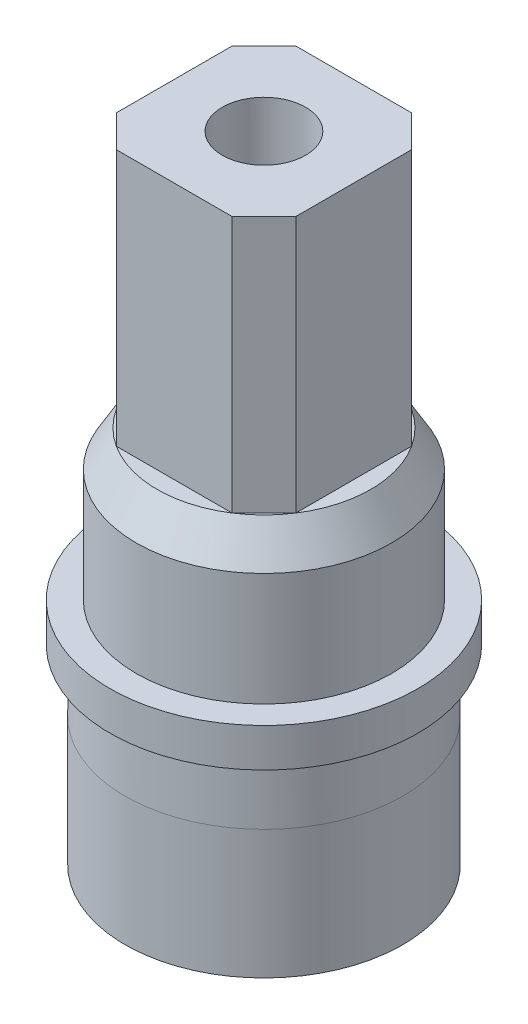
ISO-10303-21;
HEADER;
FILE_DESCRIPTION(('STEP AP214'),'2;1');
FILE_NAME('part.step','',(''),(''),'','','');
FILE_SCHEMA(('AUTOMOTIVE_DESIGN { 1 0 10303 214 1 1 1 1 }'));
ENDSEC;
DATA;
#1=APPLICATION_CONTEXT('core data for automotive mechanical design processes');
#2=APPLICATION_PROTOCOL_DEFINITION('international standard','automotive_design',2000,#1);
#3=PRODUCT_CONTEXT('',#1,'mechanical');
#4=PRODUCT('Part','Part','',(#3));
#5=PRODUCT_RELATED_PRODUCT_CATEGORY('part','',(#4));
#6=PRODUCT_DEFINITION_FORMATION('','',#4);
#7=PRODUCT_DEFINITION_CONTEXT('part definition',#1,'design');
#8=PRODUCT_DEFINITION('design','',#6,#7);
#9=PRODUCT_DEFINITION_SHAPE('','',#8);
#10=(LENGTH_UNIT() NAMED_UNIT(*) SI_UNIT(.MILLI.,.METRE.));
#11=(NAMED_UNIT(*) PLANE_ANGLE_UNIT() SI_UNIT($,.RADIAN.));
#12=(NAMED_UNIT(*) SI_UNIT($,.STERADIAN.) SOLID_ANGLE_UNIT());
#13=UNCERTAINTY_MEASURE_WITH_UNIT(LENGTH_MEASURE(1.E-05),#10,'distance_accuracy_value','');
#14=(GEOMETRIC_REPRESENTATION_CONTEXT(3) GLOBAL_UNCERTAINTY_ASSIGNED_CONTEXT((#13)) GLOBAL_UNIT_ASSIGNED_CONTEXT((#10,
#11,#12)) REPRESENTATION_CONTEXT('',''));
#15=CARTESIAN_POINT('',(0.,0.,0.));
#16=DIRECTION('',(0.,0.,1.));
#17=DIRECTION('',(1.,0.,0.));
#18=AXIS2_PLACEMENT_3D('',#15,#16,#17);
#19=CARTESIAN_POINT('',(0.,-7.46,0.));
#20=DIRECTION('',(0.,1.,0.));
#21=DIRECTION('',(0.,0.,1.));
#22=AXIS2_PLACEMENT_3D('',#19,#20,#21);
#23=CYLINDRICAL_SURFACE('',#22,4.315);
#24=CARTESIAN_POINT('',(0.,0.54,0.));
#25=DIRECTION('',(0.,-1.,0.));
#26=DIRECTION('',(0.,0.,-1.));
#27=AXIS2_PLACEMENT_3D('',#24,#25,#26);
#28=CIRCLE('',#27,4.315);
#29=CARTESIAN_POINT('',(0.,0.54,-4.315));
#30=VERTEX_POINT('',#29);
#31=EDGE_CURVE('E87',#30,#30,#28,.T.);
#32=ORIENTED_EDGE('',*,*,#31,.T.);
#33=EDGE_LOOP('',(#32));
#34=FACE_BOUND('',#33,.T.);
#35=CARTESIAN_POINT('',(0.,-3.46,0.));
#36=DIRECTION('',(0.,-1.,0.));
#37=DIRECTION('',(0.,0.,-1.));
#38=AXIS2_PLACEMENT_3D('',#35,#36,#37);
#39=CIRCLE('',#38,4.315);
#40=CARTESIAN_POINT('',(0.,-3.46,-4.315));
#41=VERTEX_POINT('',#40);
#42=EDGE_CURVE('E82',#41,#41,#39,.T.);
#43=ORIENTED_EDGE('',*,*,#42,.F.);
#44=EDGE_LOOP('',(#43));
#45=FACE_BOUND('',#44,.T.);
#46=ADVANCED_FACE('F48',(#34,#45),#23,.T.);
#47=CARTESIAN_POINT('',(0.089910847244246,2.74,-1.19662694251292));
#48=DIRECTION('',(0.0749257060368717,0.,-0.997189118760768));
#49=DIRECTION('',(-0.997189118760768,0.,-0.0749257060368717));
#50=AXIS2_PLACEMENT_3D('',#47,#48,#49);
#51=PLANE('',#50);
#52=DIRECTION('',(-0.997189118760768,0.,-0.0749257060368717));
#53=VECTOR('',#52,1.);
#54=CARTESIAN_POINT('',(0.089910847244246,-3.46,-1.19662694251292));
#55=LINE('',#54,#53);
#56=CARTESIAN_POINT('',(1.14523661458051,-3.46,-1.11733302852112));
#57=VERTEX_POINT('',#56);
#58=CARTESIAN_POINT('',(-0.965414920092013,-3.46,-1.27592085650472));
#59=VERTEX_POINT('',#58);
#60=EDGE_CURVE('E61',#57,#59,#55,.T.);
#61=ORIENTED_EDGE('',*,*,#60,.F.);
#62=DIRECTION('',(0.,-1.,0.));
#63=VECTOR('',#62,1.);
#64=CARTESIAN_POINT('',(1.1452366145805,2.74,-1.11733302852112));
#65=LINE('',#64,#63);
#66=CARTESIAN_POINT('',(1.1452366145805,0.54,-1.11733302852112));
#67=VERTEX_POINT('',#66);
#68=EDGE_CURVE('E81',#67,#57,#65,.T.);
#69=ORIENTED_EDGE('',*,*,#68,.F.);
#70=DIRECTION('',(0.997189118760768,0.,0.0749257060368717));
#71=VECTOR('',#70,1.);
#72=CARTESIAN_POINT('',(0.089910847244246,0.54,-1.19662694251292));
#73=LINE('',#72,#71);
#74=CARTESIAN_POINT('',(-0.965414920092012,0.54,-1.27592085650472));
#75=VERTEX_POINT('',#74);
#76=EDGE_CURVE('E12',#75,#67,#73,.T.);
#77=ORIENTED_EDGE('',*,*,#76,.F.);
#78=DIRECTION('',(0.,-1.,0.));
#79=VECTOR('',#78,1.);
#80=CARTESIAN_POINT('',(-0.965414920092013,2.74,-1.27592085650472));
#81=LINE('',#80,#79);
#82=EDGE_CURVE('E68',#75,#59,#81,.T.);
#83=ORIENTED_EDGE('',*,*,#82,.T.);
#84=EDGE_LOOP('',(#61,#69,#77,#83));
#85=FACE_BOUND('',#84,.T.);
#86=ADVANCED_FACE('F80',(#85),#51,.F.);
#87=CARTESIAN_POINT('',(0.,2.74,0.));
#88=DIRECTION('',(0.,-1.,0.));
#89=DIRECTION('',(0.,0.,-1.));
#90=AXIS2_PLACEMENT_3D('',#87,#88,#89);
#91=CYLINDRICAL_SURFACE('',#90,1.6);
#92=CARTESIAN_POINT('',(0.,-3.46,0.));
#93=DIRECTION('',(0.,-1.,0.));
#94=DIRECTION('',(0.,0.,-1.));
#95=AXIS2_PLACEMENT_3D('',#92,#93,#94);
#96=CIRCLE('',#95,1.6);
#97=EDGE_CURVE('E73',#57,#59,#96,.T.);
#98=ORIENTED_EDGE('',*,*,#97,.T.);
#99=ORIENTED_EDGE('',*,*,#82,.F.);
#100=CARTESIAN_POINT('',(0.,0.54,0.));
#101=DIRECTION('',(0.,-1.,0.));
#102=DIRECTION('',(0.,0.,-1.));
#103=AXIS2_PLACEMENT_3D('',#100,#101,#102);
#104=CIRCLE('',#103,1.6);
#105=EDGE_CURVE('E55',#67,#75,#104,.T.);
#106=ORIENTED_EDGE('',*,*,#105,.F.);
#107=ORIENTED_EDGE('',*,*,#68,.T.);
#108=EDGE_LOOP('',(#98,#99,#106,#107));
#109=FACE_BOUND('',#108,.T.);
#110=ADVANCED_FACE('F84',(#109),#91,.F.);
#111=CARTESIAN_POINT('',(0.,0.54,0.));
#112=DIRECTION('',(0.,-1.,0.));
#113=DIRECTION('',(0.,0.,-1.));
#114=AXIS2_PLACEMENT_3D('',#111,#112,#113);
#115=PLANE('',#114);
#116=ORIENTED_EDGE('',*,*,#105,.T.);
#117=ORIENTED_EDGE('',*,*,#76,.T.);
#118=EDGE_LOOP('',(#116,#117));
#119=FACE_BOUND('',#118,.T.);
#120=ORIENTED_EDGE('',*,*,#31,.F.);
#121=EDGE_LOOP('',(#120));
#122=FACE_BOUND('',#121,.T.);
#123=ADVANCED_FACE('F94',(#119,#122),#115,.F.);
#124=CARTESIAN_POINT('',(0.,-3.46,0.));
#125=DIRECTION('',(0.,-1.,0.));
#126=DIRECTION('',(0.,0.,-1.));
#127=AXIS2_PLACEMENT_3D('',#124,#125,#126);
#128=PLANE('',#127);
#129=ORIENTED_EDGE('',*,*,#97,.F.);
#130=ORIENTED_EDGE('',*,*,#60,.T.);
#131=EDGE_LOOP('',(#129,#130));
#132=FACE_BOUND('',#131,.T.);
#133=ORIENTED_EDGE('',*,*,#42,.T.);
#134=EDGE_LOOP('',(#133));
#135=FACE_BOUND('',#134,.T.);
#136=ADVANCED_FACE('F74',(#132,#135),#128,.T.);
#137=CLOSED_SHELL('',(#46,#86,#110,#123,#136));
#138=MANIFOLD_SOLID_BREP('B2',#137);
#139=CARTESIAN_POINT('',(0.,5.54,0.));
#140=DIRECTION('',(0.,-1.,0.));
#141=DIRECTION('',(0.,0.,-1.));
#142=AXIS2_PLACEMENT_3D('',#139,#140,#141);
#143=PLANE('',#142);
#144=DIRECTION('',(-0.997189118760768,0.,-0.0749257060368717));
#145=VECTOR('',#144,1.);
#146=CARTESIAN_POINT('',(0.089910847244246,5.54,-1.19662694251292));
#147=LINE('',#146,#145);
#148=CARTESIAN_POINT('',(0.575394497324978,5.54,-1.16014920266668));
#149=VERTEX_POINT('',#148);
#150=CARTESIAN_POINT('',(-0.395572802836486,5.54,-1.23310468235916));
#151=VERTEX_POINT('',#150);
#152=EDGE_CURVE('E244',#149,#151,#147,.T.);
#153=ORIENTED_EDGE('',*,*,#152,.F.);
#154=CARTESIAN_POINT('',(0.,5.54,0.));
#155=DIRECTION('',(0.,-1.,0.));
#156=DIRECTION('',(0.,0.,-1.));
#157=AXIS2_PLACEMENT_3D('',#154,#155,#156);
#158=CIRCLE('',#157,1.295);
#159=EDGE_CURVE('E280',#149,#151,#158,.F.);
#160=ORIENTED_EDGE('',*,*,#159,.T.);
#161=EDGE_LOOP('',(#153,#160));
#162=FACE_BOUND('',#161,.T.);
#163=ADVANCED_FACE('F143',(#162),#143,.F.);
#164=CARTESIAN_POINT('',(0.,0.,0.));
#165=DIRECTION('',(0.,-1.,0.));
#166=DIRECTION('',(0.,0.,-1.));
#167=AXIS2_PLACEMENT_3D('',#164,#165,#166);
#168=CYLINDRICAL_SURFACE('',#167,1.295);
#169=CARTESIAN_POINT('',(0.,16.2829292602701,0.));
#170=DIRECTION('',(0.,1.,0.));
#171=DIRECTION('',(0.,0.,1.));
#172=AXIS2_PLACEMENT_3D('',#169,#170,#171);
#173=CIRCLE('',#172,1.295);
#174=CARTESIAN_POINT('',(0.,16.2829292602701,1.295));
#175=VERTEX_POINT('',#174);
#176=EDGE_CURVE('E252',#175,#175,#173,.T.);
#177=ORIENTED_EDGE('',*,*,#176,.T.);
#178=EDGE_LOOP('',(#177));
#179=FACE_BOUND('',#178,.T.);
#180=DIRECTION('',(0.,-1.,0.));
#181=VECTOR('',#180,1.);
#182=CARTESIAN_POINT('',(-0.395572802836487,0.,-1.23310468235916));
#183=LINE('',#182,#181);
#184=CARTESIAN_POINT('',(-0.395572802836486,6.54,-1.23310468235916));
#185=VERTEX_POINT('',#184);
#186=EDGE_CURVE('E46',#151,#185,#183,.F.);
#187=ORIENTED_EDGE('',*,*,#186,.F.);
#188=ORIENTED_EDGE('',*,*,#159,.F.);
#189=DIRECTION('',(0.,-1.,0.));
#190=VECTOR('',#189,1.);
#191=CARTESIAN_POINT('',(0.575394497324978,0.,-1.16014920266668));
#192=LINE('',#191,#190);
#193=CARTESIAN_POINT('',(0.575394497324978,6.54,-1.16014920266668));
#194=VERTEX_POINT('',#193);
#195=EDGE_CURVE('E151',#194,#149,#192,.T.);
#196=ORIENTED_EDGE('',*,*,#195,.F.);
#197=CARTESIAN_POINT('',(0.,6.54,0.));
#198=DIRECTION('',(0.,-1.,0.));
#199=DIRECTION('',(0.,0.,-1.));
#200=AXIS2_PLACEMENT_3D('',#197,#198,#199);
#201=CIRCLE('',#200,1.295);
#202=EDGE_CURVE('E248',#185,#194,#201,.F.);
#203=ORIENTED_EDGE('',*,*,#202,.F.);
#204=EDGE_LOOP('',(#187,#188,#196,#203));
#205=FACE_BOUND('',#204,.T.);
#206=ADVANCED_FACE('F145',(#179,#205),#168,.F.);
#207=CARTESIAN_POINT('',(2.79,16.,-1.79952771581879));
#208=DIRECTION('',(-0.707106781186548,0.,0.707106781186548));
#209=DIRECTION('',(0.707106781186548,0.,0.707106781186548));
#210=AXIS2_PLACEMENT_3D('',#207,#208,#209);
#211=PLANE('',#210);
#212=DIRECTION('',(0.,-1.,0.));
#213=VECTOR('',#212,1.);
#214=CARTESIAN_POINT('',(1.79952771581879,16.,-2.79));
#215=LINE('',#214,#213);
#216=CARTESIAN_POINT('',(1.79952771581879,16.2829292602701,-2.79));
#217=VERTEX_POINT('',#216);
#218=CARTESIAN_POINT('',(1.79952771581879,8.3,-2.79));
#219=VERTEX_POINT('',#218);
#220=EDGE_CURVE('E321',#217,#219,#215,.T.);
#221=ORIENTED_EDGE('',*,*,#220,.F.);
#222=DIRECTION('',(-0.707106781186548,0.,-0.707106781186548));
#223=VECTOR('',#222,1.);
#224=CARTESIAN_POINT('',(1.79952771581879,16.2829292602701,-2.79));
#225=LINE('',#224,#223);
#226=CARTESIAN_POINT('',(2.79,16.2829292602701,-1.79952771581879));
#227=VERTEX_POINT('',#226);
#228=EDGE_CURVE('E267',#227,#217,#225,.T.);
#229=ORIENTED_EDGE('',*,*,#228,.F.);
#230=DIRECTION('',(0.,-1.,0.));
#231=VECTOR('',#230,1.);
#232=CARTESIAN_POINT('',(2.79,16.,-1.79952771581879));
#233=LINE('',#232,#231);
#234=CARTESIAN_POINT('',(2.79,8.3,-1.79952771581879));
#235=VERTEX_POINT('',#234);
#236=EDGE_CURVE('E307',#227,#235,#233,.T.);
#237=ORIENTED_EDGE('',*,*,#236,.T.);
#238=DIRECTION('',(-0.707106781186548,0.,-0.707106781186548));
#239=VECTOR('',#238,1.);
#240=CARTESIAN_POINT('',(2.79,8.3,-1.79952771581879));
#241=LINE('',#240,#239);
#242=EDGE_CURVE('E283',#235,#219,#241,.T.);
#243=ORIENTED_EDGE('',*,*,#242,.T.);
#244=EDGE_LOOP('',(#221,#229,#237,#243));
#245=FACE_BOUND('',#244,.T.);
#246=ADVANCED_FACE('F384',(#245),#211,.F.);
#247=CARTESIAN_POINT('',(1.79952771581879,16.,-2.79));
#248=DIRECTION('',(0.,0.,1.));
#249=DIRECTION('',(1.,0.,0.));
#250=AXIS2_PLACEMENT_3D('',#247,#248,#249);
#251=PLANE('',#250);
#252=DIRECTION('',(0.,-1.,0.));
#253=VECTOR('',#252,1.);
#254=CARTESIAN_POINT('',(-1.79952771581879,16.,-2.79));
#255=LINE('',#254,#253);
#256=CARTESIAN_POINT('',(-1.79952771581879,16.2829292602701,-2.79));
#257=VERTEX_POINT('',#256);
#258=CARTESIAN_POINT('',(-1.79952771581879,8.3,-2.79));
#259=VERTEX_POINT('',#258);
#260=EDGE_CURVE('E319',#257,#259,#255,.T.);
#261=ORIENTED_EDGE('',*,*,#260,.F.);
#262=DIRECTION('',(-1.,0.,0.));
#263=VECTOR('',#262,1.);
#264=CARTESIAN_POINT('',(-1.79952771581879,16.2829292602701,-2.79));
#265=LINE('',#264,#263);
#266=EDGE_CURVE('E270',#217,#257,#265,.T.);
#267=ORIENTED_EDGE('',*,*,#266,.F.);
#268=ORIENTED_EDGE('',*,*,#220,.T.);
#269=DIRECTION('',(-1.,0.,0.));
#270=VECTOR('',#269,1.);
#271=CARTESIAN_POINT('',(1.79952771581879,8.3,-2.79));
#272=LINE('',#271,#270);
#273=EDGE_CURVE('E286',#219,#259,#272,.T.);
#274=ORIENTED_EDGE('',*,*,#273,.T.);
#275=EDGE_LOOP('',(#261,#267,#268,#274));
#276=FACE_BOUND('',#275,.T.);
#277=ADVANCED_FACE('F406',(#276),#251,.F.);
#278=CARTESIAN_POINT('',(-1.79952771581879,16.,-2.79));
#279=DIRECTION('',(0.707106781186548,0.,0.707106781186548));
#280=DIRECTION('',(0.707106781186548,0.,-0.707106781186548));
#281=AXIS2_PLACEMENT_3D('',#278,#279,#280);
#282=PLANE('',#281);
#283=DIRECTION('',(0.,-1.,0.));
#284=VECTOR('',#283,1.);
#285=CARTESIAN_POINT('',(-2.79,16.,-1.79952771581879));
#286=LINE('',#285,#284);
#287=CARTESIAN_POINT('',(-2.79,16.2829292602701,-1.79952771581879));
#288=VERTEX_POINT('',#287);
#289=CARTESIAN_POINT('',(-2.79,8.3,-1.79952771581879));
#290=VERTEX_POINT('',#289);
#291=EDGE_CURVE('E317',#288,#290,#286,.T.);
#292=ORIENTED_EDGE('',*,*,#291,.F.);
#293=DIRECTION('',(-0.707106781186548,0.,0.707106781186548));
#294=VECTOR('',#293,1.);
#295=CARTESIAN_POINT('',(-2.79,16.2829292602701,-1.79952771581879));
#296=LINE('',#295,#294);
#297=EDGE_CURVE('E273',#257,#288,#296,.T.);
#298=ORIENTED_EDGE('',*,*,#297,.F.);
#299=ORIENTED_EDGE('',*,*,#260,.T.);
#300=DIRECTION('',(-0.707106781186548,0.,0.707106781186548));
#301=VECTOR('',#300,1.);
#302=CARTESIAN_POINT('',(-1.79952771581879,8.3,-2.79));
#303=LINE('',#302,#301);
#304=EDGE_CURVE('E289',#259,#290,#303,.T.);
#305=ORIENTED_EDGE('',*,*,#304,.T.);
#306=EDGE_LOOP('',(#292,#298,#299,#305));
#307=FACE_BOUND('',#306,.T.);
#308=ADVANCED_FACE('F402',(#307),#282,.F.);
#309=CARTESIAN_POINT('',(-2.79,16.,-1.79952771581879));
#310=DIRECTION('',(1.,0.,0.));
#311=DIRECTION('',(0.,0.,-1.));
#312=AXIS2_PLACEMENT_3D('',#309,#310,#311);
#313=PLANE('',#312);
#314=DIRECTION('',(0.,-1.,0.));
#315=VECTOR('',#314,1.);
#316=CARTESIAN_POINT('',(-2.79,16.,1.79952771581879));
#317=LINE('',#316,#315);
#318=CARTESIAN_POINT('',(-2.79,16.2829292602701,1.79952771581879));
#319=VERTEX_POINT('',#318);
#320=CARTESIAN_POINT('',(-2.79,8.3,1.79952771581879));
#321=VERTEX_POINT('',#320);
#322=EDGE_CURVE('E315',#319,#321,#317,.T.);
#323=ORIENTED_EDGE('',*,*,#322,.F.);
#324=DIRECTION('',(0.,0.,1.));
#325=VECTOR('',#324,1.);
#326=CARTESIAN_POINT('',(-2.79,16.2829292602701,1.79952771581879));
#327=LINE('',#326,#325);
#328=EDGE_CURVE('E240',#288,#319,#327,.T.);
#329=ORIENTED_EDGE('',*,*,#328,.F.);
#330=ORIENTED_EDGE('',*,*,#291,.T.);
#331=DIRECTION('',(0.,0.,1.));
#332=VECTOR('',#331,1.);
#333=CARTESIAN_POINT('',(-2.79,8.3,-1.79952771581879));
#334=LINE('',#333,#332);
#335=EDGE_CURVE('E292',#290,#321,#334,.T.);
#336=ORIENTED_EDGE('',*,*,#335,.T.);
#337=EDGE_LOOP('',(#323,#329,#330,#336));
#338=FACE_BOUND('',#337,.T.);
#339=ADVANCED_FACE('F398',(#338),#313,.F.);
#340=CARTESIAN_POINT('',(-2.79,16.,1.79952771581879));
#341=DIRECTION('',(0.707106781186548,0.,-0.707106781186548));
#342=DIRECTION('',(-0.707106781186548,0.,-0.707106781186548));
#343=AXIS2_PLACEMENT_3D('',#340,#341,#342);
#344=PLANE('',#343);
#345=DIRECTION('',(0.,-1.,0.));
#346=VECTOR('',#345,1.);
#347=CARTESIAN_POINT('',(-1.79952771581879,16.,2.79));
#348=LINE('',#347,#346);
#349=CARTESIAN_POINT('',(-1.79952771581879,16.2829292602701,2.79));
#350=VERTEX_POINT('',#349);
#351=CARTESIAN_POINT('',(-1.79952771581879,8.3,2.79));
#352=VERTEX_POINT('',#351);
#353=EDGE_CURVE('E313',#350,#352,#348,.T.);
#354=ORIENTED_EDGE('',*,*,#353,.F.);
#355=DIRECTION('',(0.707106781186548,0.,0.707106781186548));
#356=VECTOR('',#355,1.);
#357=CARTESIAN_POINT('',(-1.79952771581879,16.2829292602701,2.79));
#358=LINE('',#357,#356);
#359=EDGE_CURVE('E255',#319,#350,#358,.T.);
#360=ORIENTED_EDGE('',*,*,#359,.F.);
#361=ORIENTED_EDGE('',*,*,#322,.T.);
#362=DIRECTION('',(0.707106781186548,0.,0.707106781186548));
#363=VECTOR('',#362,1.);
#364=CARTESIAN_POINT('',(-2.79,8.3,1.79952771581879));
#365=LINE('',#364,#363);
#366=EDGE_CURVE('E295',#321,#352,#365,.T.);
#367=ORIENTED_EDGE('',*,*,#366,.T.);
#368=EDGE_LOOP('',(#354,#360,#361,#367));
#369=FACE_BOUND('',#368,.T.);
#370=ADVANCED_FACE('F394',(#369),#344,.F.);
#371=CARTESIAN_POINT('',(-1.79952771581879,16.,2.79));
#372=DIRECTION('',(0.,0.,-1.));
#373=DIRECTION('',(-1.,0.,0.));
#374=AXIS2_PLACEMENT_3D('',#371,#372,#373);
#375=PLANE('',#374);
#376=DIRECTION('',(0.,-1.,0.));
#377=VECTOR('',#376,1.);
#378=CARTESIAN_POINT('',(1.79952771581879,16.,2.79));
#379=LINE('',#378,#377);
#380=CARTESIAN_POINT('',(1.79952771581879,16.2829292602701,2.79));
#381=VERTEX_POINT('',#380);
#382=CARTESIAN_POINT('',(1.79952771581879,8.3,2.79));
#383=VERTEX_POINT('',#382);
#384=EDGE_CURVE('E311',#381,#383,#379,.T.);
#385=ORIENTED_EDGE('',*,*,#384,.F.);
#386=DIRECTION('',(1.,0.,0.));
#387=VECTOR('',#386,1.);
#388=CARTESIAN_POINT('',(1.79952771581879,16.2829292602701,2.79));
#389=LINE('',#388,#387);
#390=EDGE_CURVE('E258',#350,#381,#389,.T.);
#391=ORIENTED_EDGE('',*,*,#390,.F.);
#392=ORIENTED_EDGE('',*,*,#353,.T.);
#393=DIRECTION('',(1.,0.,0.));
#394=VECTOR('',#393,1.);
#395=CARTESIAN_POINT('',(-1.79952771581879,8.3,2.79));
#396=LINE('',#395,#394);
#397=EDGE_CURVE('E298',#352,#383,#396,.T.);
#398=ORIENTED_EDGE('',*,*,#397,.T.);
#399=EDGE_LOOP('',(#385,#391,#392,#398));
#400=FACE_BOUND('',#399,.T.);
#401=ADVANCED_FACE('F390',(#400),#375,.F.);
#402=CARTESIAN_POINT('',(1.79952771581879,16.,2.79));
#403=DIRECTION('',(-0.707106781186548,0.,-0.707106781186548));
#404=DIRECTION('',(-0.707106781186548,0.,0.707106781186548));
#405=AXIS2_PLACEMENT_3D('',#402,#403,#404);
#406=PLANE('',#405);
#407=DIRECTION('',(0.,-1.,0.));
#408=VECTOR('',#407,1.);
#409=CARTESIAN_POINT('',(2.79,16.,1.79952771581879));
#410=LINE('',#409,#408);
#411=CARTESIAN_POINT('',(2.79,16.2829292602701,1.79952771581879));
#412=VERTEX_POINT('',#411);
#413=CARTESIAN_POINT('',(2.79,8.3,1.79952771581879));
#414=VERTEX_POINT('',#413);
#415=EDGE_CURVE('E309',#412,#414,#410,.T.);
#416=ORIENTED_EDGE('',*,*,#415,.F.);
#417=DIRECTION('',(0.707106781186548,0.,-0.707106781186548));
#418=VECTOR('',#417,1.);
#419=CARTESIAN_POINT('',(2.79,16.2829292602701,1.79952771581879));
#420=LINE('',#419,#418);
#421=EDGE_CURVE('E261',#381,#412,#420,.T.);
#422=ORIENTED_EDGE('',*,*,#421,.F.);
#423=ORIENTED_EDGE('',*,*,#384,.T.);
#424=DIRECTION('',(0.707106781186548,0.,-0.707106781186548));
#425=VECTOR('',#424,1.);
#426=CARTESIAN_POINT('',(1.79952771581879,8.3,2.79));
#427=LINE('',#426,#425);
#428=EDGE_CURVE('E301',#383,#414,#427,.T.);
#429=ORIENTED_EDGE('',*,*,#428,.T.);
#430=EDGE_LOOP('',(#416,#422,#423,#429));
#431=FACE_BOUND('',#430,.T.);
#432=ADVANCED_FACE('F374',(#431),#406,.F.);
#433=CARTESIAN_POINT('',(2.79,16.,1.79952771581879));
#434=DIRECTION('',(-1.,0.,0.));
#435=DIRECTION('',(0.,0.,1.));
#436=AXIS2_PLACEMENT_3D('',#433,#434,#435);
#437=PLANE('',#436);
#438=ORIENTED_EDGE('',*,*,#236,.F.);
#439=DIRECTION('',(0.,0.,-1.));
#440=VECTOR('',#439,1.);
#441=CARTESIAN_POINT('',(2.79,16.2829292602701,-1.79952771581879));
#442=LINE('',#441,#440);
#443=EDGE_CURVE('E264',#412,#227,#442,.T.);
#444=ORIENTED_EDGE('',*,*,#443,.F.);
#445=ORIENTED_EDGE('',*,*,#415,.T.);
#446=DIRECTION('',(0.,0.,-1.));
#447=VECTOR('',#446,1.);
#448=CARTESIAN_POINT('',(2.79,8.3,1.79952771581879));
#449=LINE('',#448,#447);
#450=EDGE_CURVE('E304',#414,#235,#449,.T.);
#451=ORIENTED_EDGE('',*,*,#450,.T.);
#452=EDGE_LOOP('',(#438,#444,#445,#451));
#453=FACE_BOUND('',#452,.T.);
#454=ADVANCED_FACE('F364',(#453),#437,.F.);
#455=CARTESIAN_POINT('',(0.,2.47,0.));
#456=DIRECTION('',(0.,-1.,0.));
#457=DIRECTION('',(0.,0.,-1.));
#458=AXIS2_PLACEMENT_3D('',#455,#456,#457);
#459=CONICAL_SURFACE('',#458,4.28,0.018216608185291);
#460=CARTESIAN_POINT('',(0.,2.47,0.));
#461=DIRECTION('',(0.,-1.,0.));
#462=DIRECTION('',(0.,0.,-1.));
#463=AXIS2_PLACEMENT_3D('',#460,#461,#462);
#464=CIRCLE('',#463,4.28);
#465=CARTESIAN_POINT('',(0.,2.47,-4.28));
#466=VERTEX_POINT('',#465);
#467=EDGE_CURVE('E323',#466,#466,#464,.T.);
#468=ORIENTED_EDGE('',*,*,#467,.T.);
#469=EDGE_LOOP('',(#468));
#470=FACE_BOUND('',#469,.T.);
#471=CARTESIAN_POINT('',(0.,0.54,0.));
#472=DIRECTION('',(0.,-1.,0.));
#473=DIRECTION('',(0.,0.,-1.));
#474=AXIS2_PLACEMENT_3D('',#471,#472,#473);
#475=CIRCLE('',#474,4.31516194331984);
#476=CARTESIAN_POINT('',(0.,0.54,-4.31516194331984));
#477=VERTEX_POINT('',#476);
#478=EDGE_CURVE('E278',#477,#477,#475,.T.);
#479=ORIENTED_EDGE('',*,*,#478,.F.);
#480=EDGE_LOOP('',(#479));
#481=FACE_BOUND('',#480,.T.);
#482=ADVANCED_FACE('F361',(#470,#481),#459,.T.);
#483=CARTESIAN_POINT('',(-1.295,8.3,0.));
#484=DIRECTION('',(0.,-1.,0.));
#485=DIRECTION('',(0.,0.,-1.));
#486=AXIS2_PLACEMENT_3D('',#483,#484,#485);
#487=PLANE('',#486);
#488=ORIENTED_EDGE('',*,*,#242,.F.);
#489=CARTESIAN_POINT('',(0.,8.3,0.));
#490=DIRECTION('',(0.,-1.,0.));
#491=DIRECTION('',(0.,0.,-1.));
#492=AXIS2_PLACEMENT_3D('',#489,#490,#491);
#493=CIRCLE('',#492,3.32);
#494=EDGE_CURVE('E339',#219,#235,#493,.T.);
#495=ORIENTED_EDGE('',*,*,#494,.F.);
#496=EDGE_LOOP('',(#488,#495));
#497=FACE_BOUND('',#496,.T.);
#498=ADVANCED_FACE('F363',(#497),#487,.F.);
#499=ORIENTED_EDGE('',*,*,#450,.F.);
#500=EDGE_CURVE('E343',#235,#414,#493,.T.);
#501=ORIENTED_EDGE('',*,*,#500,.F.);
#502=EDGE_LOOP('',(#499,#501));
#503=FACE_BOUND('',#502,.T.);
#504=ADVANCED_FACE('F371',(#503),#487,.F.);
#505=ORIENTED_EDGE('',*,*,#428,.F.);
#506=EDGE_CURVE('E718',#414,#383,#493,.T.);
#507=ORIENTED_EDGE('',*,*,#506,.F.);
#508=EDGE_LOOP('',(#505,#507));
#509=FACE_BOUND('',#508,.T.);
#510=ADVANCED_FACE('F632',(#509),#487,.F.);
#511=ORIENTED_EDGE('',*,*,#397,.F.);
#512=EDGE_CURVE('E707',#383,#352,#493,.T.);
#513=ORIENTED_EDGE('',*,*,#512,.F.);
#514=EDGE_LOOP('',(#511,#513));
#515=FACE_BOUND('',#514,.T.);
#516=ADVANCED_FACE('F640',(#515),#487,.F.);
#517=ORIENTED_EDGE('',*,*,#366,.F.);
#518=EDGE_CURVE('E702',#352,#321,#493,.T.);
#519=ORIENTED_EDGE('',*,*,#518,.F.);
#520=EDGE_LOOP('',(#517,#519));
#521=FACE_BOUND('',#520,.T.);
#522=ADVANCED_FACE('F445',(#521),#487,.F.);
#523=ORIENTED_EDGE('',*,*,#335,.F.);
#524=EDGE_CURVE('E435',#321,#290,#493,.T.);
#525=ORIENTED_EDGE('',*,*,#524,.F.);
#526=EDGE_LOOP('',(#523,#525));
#527=FACE_BOUND('',#526,.T.);
#528=ADVANCED_FACE('F440',(#527),#487,.F.);
#529=ORIENTED_EDGE('',*,*,#304,.F.);
#530=EDGE_CURVE('E429',#290,#259,#493,.T.);
#531=ORIENTED_EDGE('',*,*,#530,.F.);
#532=EDGE_LOOP('',(#529,#531));
#533=FACE_BOUND('',#532,.T.);
#534=ADVANCED_FACE('F438',(#533),#487,.F.);
#535=ORIENTED_EDGE('',*,*,#273,.F.);
#536=EDGE_CURVE('E338',#259,#219,#493,.T.);
#537=ORIENTED_EDGE('',*,*,#536,.F.);
#538=EDGE_LOOP('',(#535,#537));
#539=FACE_BOUND('',#538,.T.);
#540=ADVANCED_FACE('F373',(#539),#487,.F.);
#541=CARTESIAN_POINT('',(0.,8.3,0.));
#542=DIRECTION('',(0.,-1.,0.));
#543=DIRECTION('',(0.,0.,-1.));
#544=AXIS2_PLACEMENT_3D('',#541,#542,#543);
#545=CONICAL_SURFACE('',#544,3.32,0.527554966909787);
#546=CARTESIAN_POINT('',(0.,7.18438312144079,0.));
#547=DIRECTION('',(0.,-1.,0.));
#548=DIRECTION('',(0.,0.,-1.));
#549=AXIS2_PLACEMENT_3D('',#546,#547,#548);
#550=CIRCLE('',#549,3.97);
#551=CARTESIAN_POINT('',(0.,7.18438312144079,-3.97));
#552=VERTEX_POINT('',#551);
#553=EDGE_CURVE('E335',#552,#552,#550,.T.);
#554=ORIENTED_EDGE('',*,*,#553,.F.);
#555=EDGE_LOOP('',(#554));
#556=FACE_BOUND('',#555,.T.);
#557=ORIENTED_EDGE('',*,*,#494,.T.);
#558=ORIENTED_EDGE('',*,*,#500,.T.);
#559=ORIENTED_EDGE('',*,*,#506,.T.);
#560=ORIENTED_EDGE('',*,*,#512,.T.);
#561=ORIENTED_EDGE('',*,*,#518,.T.);
#562=ORIENTED_EDGE('',*,*,#524,.T.);
#563=ORIENTED_EDGE('',*,*,#530,.T.);
#564=ORIENTED_EDGE('',*,*,#536,.T.);
#565=EDGE_LOOP('',(#557,#558,#559,#560,#561,#562,#563,#564));
#566=FACE_BOUND('',#565,.T.);
#567=ADVANCED_FACE('F431',(#556,#566),#545,.T.);
#568=CARTESIAN_POINT('',(0.,0.,0.));
#569=DIRECTION('',(0.,-1.,0.));
#570=DIRECTION('',(0.,0.,-1.));
#571=AXIS2_PLACEMENT_3D('',#568,#569,#570);
#572=CYLINDRICAL_SURFACE('',#571,3.97);
#573=CARTESIAN_POINT('',(0.,3.67,0.));
#574=DIRECTION('',(0.,-1.,0.));
#575=DIRECTION('',(0.,0.,-1.));
#576=AXIS2_PLACEMENT_3D('',#573,#574,#575);
#577=CIRCLE('',#576,3.97);
#578=CARTESIAN_POINT('',(0.,3.67,-3.97));
#579=VERTEX_POINT('',#578);
#580=EDGE_CURVE('E332',#579,#579,#577,.T.);
#581=ORIENTED_EDGE('',*,*,#580,.F.);
#582=EDGE_LOOP('',(#581));
#583=FACE_BOUND('',#582,.T.);
#584=ORIENTED_EDGE('',*,*,#553,.T.);
#585=EDGE_LOOP('',(#584));
#586=FACE_BOUND('',#585,.T.);
#587=ADVANCED_FACE('F450',(#583,#586),#572,.T.);
#588=CARTESIAN_POINT('',(-3.97,3.67,0.));
#589=DIRECTION('',(0.,-1.,0.));
#590=DIRECTION('',(0.,0.,-1.));
#591=AXIS2_PLACEMENT_3D('',#588,#589,#590);
#592=PLANE('',#591);
#593=CARTESIAN_POINT('',(0.,3.67,0.));
#594=DIRECTION('',(0.,-1.,0.));
#595=DIRECTION('',(0.,0.,-1.));
#596=AXIS2_PLACEMENT_3D('',#593,#594,#595);
#597=CIRCLE('',#596,4.785);
#598=CARTESIAN_POINT('',(0.,3.67,-4.785));
#599=VERTEX_POINT('',#598);
#600=EDGE_CURVE('E329',#599,#599,#597,.T.);
#601=ORIENTED_EDGE('',*,*,#600,.F.);
#602=EDGE_LOOP('',(#601));
#603=FACE_BOUND('',#602,.T.);
#604=ORIENTED_EDGE('',*,*,#580,.T.);
#605=EDGE_LOOP('',(#604));
#606=FACE_BOUND('',#605,.T.);
#607=ADVANCED_FACE('F454',(#603,#606),#592,.F.);
#608=CARTESIAN_POINT('',(0.,0.,0.));
#609=DIRECTION('',(0.,-1.,0.));
#610=DIRECTION('',(0.,0.,-1.));
#611=AXIS2_PLACEMENT_3D('',#608,#609,#610);
#612=CYLINDRICAL_SURFACE('',#611,4.785);
#613=CARTESIAN_POINT('',(0.,2.47,0.));
#614=DIRECTION('',(0.,-1.,0.));
#615=DIRECTION('',(0.,0.,-1.));
#616=AXIS2_PLACEMENT_3D('',#613,#614,#615);
#617=CIRCLE('',#616,4.785);
#618=CARTESIAN_POINT('',(0.,2.47,-4.785));
#619=VERTEX_POINT('',#618);
#620=EDGE_CURVE('E326',#619,#619,#617,.T.);
#621=ORIENTED_EDGE('',*,*,#620,.F.);
#622=EDGE_LOOP('',(#621));
#623=FACE_BOUND('',#622,.T.);
#624=ORIENTED_EDGE('',*,*,#600,.T.);
#625=EDGE_LOOP('',(#624));
#626=FACE_BOUND('',#625,.T.);
#627=ADVANCED_FACE('F458',(#623,#626),#612,.T.);
#628=CARTESIAN_POINT('',(-4.785,2.47,0.));
#629=DIRECTION('',(0.,1.,0.));
#630=DIRECTION('',(0.,0.,1.));
#631=AXIS2_PLACEMENT_3D('',#628,#629,#630);
#632=PLANE('',#631);
#633=ORIENTED_EDGE('',*,*,#467,.F.);
#634=EDGE_LOOP('',(#633));
#635=FACE_BOUND('',#634,.T.);
#636=ORIENTED_EDGE('',*,*,#620,.T.);
#637=EDGE_LOOP('',(#636));
#638=FACE_BOUND('',#637,.T.);
#639=ADVANCED_FACE('F357',(#635,#638),#632,.F.);
#640=CARTESIAN_POINT('',(0.,0.54,0.));
#641=DIRECTION('',(0.,-1.,0.));
#642=DIRECTION('',(0.,0.,-1.));
#643=AXIS2_PLACEMENT_3D('',#640,#641,#642);
#644=PLANE('',#643);
#645=DIRECTION('',(0.997189118760768,0.,0.0749257060368717));
#646=VECTOR('',#645,1.);
#647=CARTESIAN_POINT('',(0.089910847244246,0.54,-1.19662694251292));
#648=LINE('',#647,#646);
#649=CARTESIAN_POINT('',(-0.965414920092013,0.54,-1.27592085650472));
#650=VERTEX_POINT('',#649);
#651=CARTESIAN_POINT('',(1.1452366145805,0.54,-1.11733302852112));
#652=VERTEX_POINT('',#651);
#653=EDGE_CURVE('E237',#650,#652,#648,.T.);
#654=ORIENTED_EDGE('',*,*,#653,.F.);
#655=CARTESIAN_POINT('',(0.,0.54,0.));
#656=DIRECTION('',(0.,-1.,0.));
#657=DIRECTION('',(0.,0.,-1.));
#658=AXIS2_PLACEMENT_3D('',#655,#656,#657);
#659=CIRCLE('',#658,1.6);
#660=EDGE_CURVE('E342',#652,#650,#659,.T.);
#661=ORIENTED_EDGE('',*,*,#660,.F.);
#662=EDGE_LOOP('',(#654,#661));
#663=FACE_BOUND('',#662,.T.);
#664=ORIENTED_EDGE('',*,*,#478,.T.);
#665=EDGE_LOOP('',(#664));
#666=FACE_BOUND('',#665,.T.);
#667=ADVANCED_FACE('F354',(#663,#666),#644,.T.);
#668=CARTESIAN_POINT('',(0.089910847244246,2.74,-1.19662694251292));
#669=DIRECTION('',(0.0749257060368717,0.,-0.997189118760768));
#670=DIRECTION('',(-0.997189118760768,0.,-0.0749257060368717));
#671=AXIS2_PLACEMENT_3D('',#668,#669,#670);
#672=PLANE('',#671);
#673=ORIENTED_EDGE('',*,*,#653,.T.);
#674=DIRECTION('',(0.,-1.,0.));
#675=VECTOR('',#674,1.);
#676=CARTESIAN_POINT('',(1.1452366145805,2.74,-1.11733302852112));
#677=LINE('',#676,#675);
#678=CARTESIAN_POINT('',(1.14523661458051,6.54,-1.11733302852112));
#679=VERTEX_POINT('',#678);
#680=EDGE_CURVE('E165',#679,#652,#677,.T.);
#681=ORIENTED_EDGE('',*,*,#680,.F.);
#682=DIRECTION('',(-0.997189118760768,0.,-0.0749257060368717));
#683=VECTOR('',#682,1.);
#684=CARTESIAN_POINT('',(0.089910847244246,6.54,-1.19662694251292));
#685=LINE('',#684,#683);
#686=EDGE_CURVE('E233',#679,#194,#685,.T.);
#687=ORIENTED_EDGE('',*,*,#686,.T.);
#688=ORIENTED_EDGE('',*,*,#195,.T.);
#689=ORIENTED_EDGE('',*,*,#152,.T.);
#690=ORIENTED_EDGE('',*,*,#186,.T.);
#691=CARTESIAN_POINT('',(-0.965414920092013,6.54,-1.27592085650472));
#692=VERTEX_POINT('',#691);
#693=EDGE_CURVE('E158',#185,#692,#685,.T.);
#694=ORIENTED_EDGE('',*,*,#693,.T.);
#695=DIRECTION('',(0.,-1.,0.));
#696=VECTOR('',#695,1.);
#697=CARTESIAN_POINT('',(-0.965414920092013,2.74,-1.27592085650472));
#698=LINE('',#697,#696);
#699=EDGE_CURVE('E239',#692,#650,#698,.T.);
#700=ORIENTED_EDGE('',*,*,#699,.T.);
#701=EDGE_LOOP('',(#673,#681,#687,#688,#689,#690,#694,#700));
#702=FACE_BOUND('',#701,.T.);
#703=ADVANCED_FACE('F231',(#702),#672,.F.);
#704=CARTESIAN_POINT('',(0.,2.74,0.));
#705=DIRECTION('',(0.,-1.,0.));
#706=DIRECTION('',(0.,0.,-1.));
#707=AXIS2_PLACEMENT_3D('',#704,#705,#706);
#708=CYLINDRICAL_SURFACE('',#707,1.6);
#709=ORIENTED_EDGE('',*,*,#660,.T.);
#710=ORIENTED_EDGE('',*,*,#699,.F.);
#711=CARTESIAN_POINT('',(0.,6.54,0.));
#712=DIRECTION('',(0.,-1.,0.));
#713=DIRECTION('',(0.,0.,-1.));
#714=AXIS2_PLACEMENT_3D('',#711,#712,#713);
#715=CIRCLE('',#714,1.6);
#716=EDGE_CURVE('E242',#692,#679,#715,.F.);
#717=ORIENTED_EDGE('',*,*,#716,.T.);
#718=ORIENTED_EDGE('',*,*,#680,.T.);
#719=EDGE_LOOP('',(#709,#710,#717,#718));
#720=FACE_BOUND('',#719,.T.);
#721=ADVANCED_FACE('F243',(#720),#708,.F.);
#722=CARTESIAN_POINT('',(0.,16.2829292602701,0.));
#723=DIRECTION('',(0.,-1.,0.));
#724=DIRECTION('',(0.,0.,-1.));
#725=AXIS2_PLACEMENT_3D('',#722,#723,#724);
#726=PLANE('',#725);
#727=ORIENTED_EDGE('',*,*,#359,.T.);
#728=ORIENTED_EDGE('',*,*,#390,.T.);
#729=ORIENTED_EDGE('',*,*,#421,.T.);
#730=ORIENTED_EDGE('',*,*,#443,.T.);
#731=ORIENTED_EDGE('',*,*,#228,.T.);
#732=ORIENTED_EDGE('',*,*,#266,.T.);
#733=ORIENTED_EDGE('',*,*,#297,.T.);
#734=ORIENTED_EDGE('',*,*,#328,.T.);
#735=EDGE_LOOP('',(#727,#728,#729,#730,#731,#732,#733,#734));
#736=FACE_BOUND('',#735,.T.);
#737=ORIENTED_EDGE('',*,*,#176,.F.);
#738=EDGE_LOOP('',(#737));
#739=FACE_BOUND('',#738,.T.);
#740=ADVANCED_FACE('F419',(#736,#739),#726,.F.);
#741=CARTESIAN_POINT('',(0.,6.54,0.));
#742=DIRECTION('',(0.,-1.,0.));
#743=DIRECTION('',(0.,0.,-1.));
#744=AXIS2_PLACEMENT_3D('',#741,#742,#743);
#745=PLANE('',#744);
#746=ORIENTED_EDGE('',*,*,#202,.T.);
#747=ORIENTED_EDGE('',*,*,#686,.F.);
#748=ORIENTED_EDGE('',*,*,#716,.F.);
#749=ORIENTED_EDGE('',*,*,#693,.F.);
#750=EDGE_LOOP('',(#746,#747,#748,#749));
#751=FACE_BOUND('',#750,.T.);
#752=ADVANCED_FACE('F246',(#751),#745,.T.);
#753=CLOSED_SHELL('',(#163,#206,#246,#277,#308,#339,#370,#401,#432,#454,#482,#498,#504,#510,
#516,#522,#528,#534,#540,#567,#587,#607,#627,#639,#667,#703,#721,#740,#752));
#754=MANIFOLD_SOLID_BREP('B6',#753);
#755=ADVANCED_BREP_SHAPE_REPRESENTATION('',(#18,#138,#754),#14);
#756=SHAPE_DEFINITION_REPRESENTATION(#9,#755);
ENDSEC;
END-ISO-10303-21;
